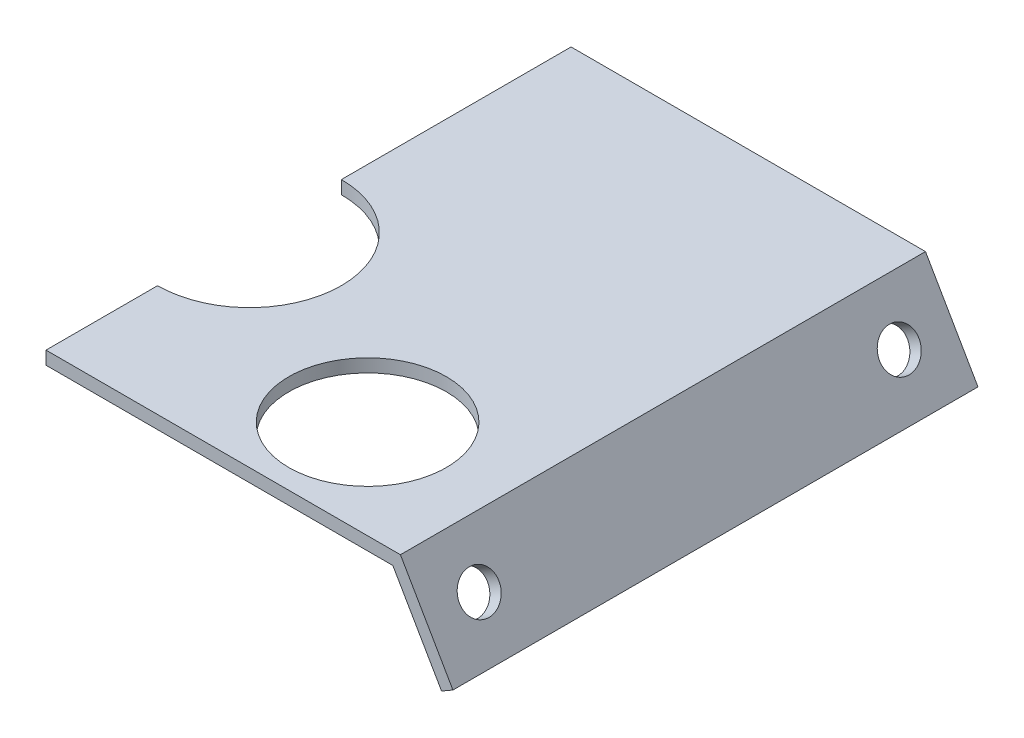
ISO-10303-21;
HEADER;
FILE_DESCRIPTION(('STEP AP214'),'2;1');
FILE_NAME('part.step','',(''),(''),'','','');
FILE_SCHEMA(('AUTOMOTIVE_DESIGN { 1 0 10303 214 1 1 1 1 }'));
ENDSEC;
DATA;
#1=APPLICATION_CONTEXT('core data for automotive mechanical design processes');
#2=APPLICATION_PROTOCOL_DEFINITION('international standard','automotive_design',2000,#1);
#3=PRODUCT_CONTEXT('',#1,'mechanical');
#4=PRODUCT('Part','Part','',(#3));
#5=PRODUCT_RELATED_PRODUCT_CATEGORY('part','',(#4));
#6=PRODUCT_DEFINITION_FORMATION('','',#4);
#7=PRODUCT_DEFINITION_CONTEXT('part definition',#1,'design');
#8=PRODUCT_DEFINITION('design','',#6,#7);
#9=PRODUCT_DEFINITION_SHAPE('','',#8);
#10=(LENGTH_UNIT() NAMED_UNIT(*) SI_UNIT(.MILLI.,.METRE.));
#11=(NAMED_UNIT(*) PLANE_ANGLE_UNIT() SI_UNIT($,.RADIAN.));
#12=(NAMED_UNIT(*) SI_UNIT($,.STERADIAN.) SOLID_ANGLE_UNIT());
#13=UNCERTAINTY_MEASURE_WITH_UNIT(LENGTH_MEASURE(1.E-05),#10,'distance_accuracy_value','');
#14=(GEOMETRIC_REPRESENTATION_CONTEXT(3) GLOBAL_UNCERTAINTY_ASSIGNED_CONTEXT((#13)) GLOBAL_UNIT_ASSIGNED_CONTEXT((#10,
#11,#12)) REPRESENTATION_CONTEXT('',''));
#15=CARTESIAN_POINT('',(0.,0.,0.));
#16=DIRECTION('',(0.,0.,1.));
#17=DIRECTION('',(1.,0.,0.));
#18=AXIS2_PLACEMENT_3D('',#15,#16,#17);
#19=CARTESIAN_POINT('',(0.,0.,40.));
#20=DIRECTION('',(1.,0.,0.));
#21=DIRECTION('',(0.,0.,-1.));
#22=AXIS2_PLACEMENT_3D('',#19,#20,#21);
#23=PLANE('',#22);
#24=DIRECTION('',(0.,0.,-1.));
#25=VECTOR('',#24,1.);
#26=CARTESIAN_POINT('',(0.,-1.,40.));
#27=LINE('',#26,#25);
#28=CARTESIAN_POINT('',(0.,-1.,17.5));
#29=VERTEX_POINT('',#28);
#30=CARTESIAN_POINT('',(0.,-1.,0.));
#31=VERTEX_POINT('',#30);
#32=EDGE_CURVE('E39',#29,#31,#27,.T.);
#33=ORIENTED_EDGE('',*,*,#32,.F.);
#34=DIRECTION('',(0.,1.,0.));
#35=VECTOR('',#34,1.);
#36=CARTESIAN_POINT('',(0.,-40.,17.5));
#37=LINE('',#36,#35);
#38=CARTESIAN_POINT('',(0.,0.,17.5));
#39=VERTEX_POINT('',#38);
#40=EDGE_CURVE('E185',#29,#39,#37,.T.);
#41=ORIENTED_EDGE('',*,*,#40,.T.);
#42=DIRECTION('',(0.,0.,-1.));
#43=VECTOR('',#42,1.);
#44=CARTESIAN_POINT('',(0.,0.,40.));
#45=LINE('',#44,#43);
#46=CARTESIAN_POINT('',(0.,0.,0.));
#47=VERTEX_POINT('',#46);
#48=EDGE_CURVE('E83',#39,#47,#45,.T.);
#49=ORIENTED_EDGE('',*,*,#48,.T.);
#50=DIRECTION('',(0.,-1.,0.));
#51=VECTOR('',#50,1.);
#52=CARTESIAN_POINT('',(0.,0.,0.));
#53=LINE('',#52,#51);
#54=EDGE_CURVE('E128',#47,#31,#53,.T.);
#55=ORIENTED_EDGE('',*,*,#54,.T.);
#56=EDGE_LOOP('',(#33,#41,#49,#55));
#57=FACE_BOUND('',#56,.T.);
#58=ADVANCED_FACE('F31',(#57),#23,.F.);
#59=CARTESIAN_POINT('',(0.,0.,40.));
#60=VERTEX_POINT('',#59);
#61=CARTESIAN_POINT('',(0.,0.,31.5));
#62=VERTEX_POINT('',#61);
#63=EDGE_CURVE('E141',#60,#62,#45,.T.);
#64=ORIENTED_EDGE('',*,*,#63,.T.);
#65=DIRECTION('',(0.,1.,0.));
#66=VECTOR('',#65,1.);
#67=CARTESIAN_POINT('',(0.,-40.,31.5));
#68=LINE('',#67,#66);
#69=CARTESIAN_POINT('',(0.,-1.,31.5));
#70=VERTEX_POINT('',#69);
#71=EDGE_CURVE('E46',#62,#70,#68,.F.);
#72=ORIENTED_EDGE('',*,*,#71,.T.);
#73=CARTESIAN_POINT('',(0.,-1.,40.));
#74=VERTEX_POINT('',#73);
#75=EDGE_CURVE('E11',#74,#70,#27,.T.);
#76=ORIENTED_EDGE('',*,*,#75,.F.);
#77=DIRECTION('',(0.,-1.,0.));
#78=VECTOR('',#77,1.);
#79=CARTESIAN_POINT('',(0.,0.,40.));
#80=LINE('',#79,#78);
#81=EDGE_CURVE('E140',#60,#74,#80,.T.);
#82=ORIENTED_EDGE('',*,*,#81,.F.);
#83=EDGE_LOOP('',(#64,#72,#76,#82));
#84=FACE_BOUND('',#83,.T.);
#85=ADVANCED_FACE('F33',(#84),#23,.F.);
#86=CARTESIAN_POINT('',(0.,-1.,40.));
#87=DIRECTION('',(0.,1.,0.));
#88=DIRECTION('',(0.,0.,1.));
#89=AXIS2_PLACEMENT_3D('',#86,#87,#88);
#90=PLANE('',#89);
#91=CARTESIAN_POINT('',(17.,-1.,32.5));
#92=DIRECTION('',(0.,1.,0.));
#93=DIRECTION('',(0.,0.,1.));
#94=AXIS2_PLACEMENT_3D('',#91,#92,#93);
#95=CIRCLE('',#94,6.);
#96=CARTESIAN_POINT('',(17.,-1.,38.5));
#97=VERTEX_POINT('',#96);
#98=EDGE_CURVE('E176',#97,#97,#95,.T.);
#99=ORIENTED_EDGE('',*,*,#98,.T.);
#100=EDGE_LOOP('',(#99));
#101=FACE_BOUND('',#100,.T.);
#102=ORIENTED_EDGE('',*,*,#75,.T.);
#103=CARTESIAN_POINT('',(0.,-1.,24.5));
#104=DIRECTION('',(0.,1.,0.));
#105=DIRECTION('',(0.,0.,1.));
#106=AXIS2_PLACEMENT_3D('',#103,#104,#105);
#107=CIRCLE('',#106,7.);
#108=EDGE_CURVE('E153',#70,#29,#107,.T.);
#109=ORIENTED_EDGE('',*,*,#108,.T.);
#110=ORIENTED_EDGE('',*,*,#32,.T.);
#111=DIRECTION('',(1.,0.,0.));
#112=VECTOR('',#111,1.);
#113=CARTESIAN_POINT('',(0.,-1.,0.));
#114=LINE('',#113,#112);
#115=CARTESIAN_POINT('',(26.4226497308104,-1.,0.));
#116=VERTEX_POINT('',#115);
#117=EDGE_CURVE('E130',#31,#116,#114,.T.);
#118=ORIENTED_EDGE('',*,*,#117,.T.);
#119=DIRECTION('',(0.,0.,-1.));
#120=VECTOR('',#119,1.);
#121=CARTESIAN_POINT('',(26.4226497308104,-1.,40.));
#122=LINE('',#121,#120);
#123=CARTESIAN_POINT('',(26.4226497308104,-1.,40.));
#124=VERTEX_POINT('',#123);
#125=EDGE_CURVE('E145',#124,#116,#122,.T.);
#126=ORIENTED_EDGE('',*,*,#125,.F.);
#127=DIRECTION('',(1.,0.,0.));
#128=VECTOR('',#127,1.);
#129=CARTESIAN_POINT('',(0.,-1.,40.));
#130=LINE('',#129,#128);
#131=EDGE_CURVE('E91',#74,#124,#130,.T.);
#132=ORIENTED_EDGE('',*,*,#131,.F.);
#133=EDGE_LOOP('',(#102,#109,#110,#118,#126,#132));
#134=FACE_BOUND('',#133,.T.);
#135=ADVANCED_FACE('F152',(#101,#134),#90,.F.);
#136=CARTESIAN_POINT('',(26.4226497308104,-1.,40.));
#137=DIRECTION('',(0.866025403784439,0.5,0.));
#138=DIRECTION('',(-0.5,0.866025403784439,0.));
#139=AXIS2_PLACEMENT_3D('',#136,#137,#138);
#140=PLANE('',#139);
#141=CARTESIAN_POINT('',(28.1339745962156,-3.96410161513775,4.));
#142=DIRECTION('',(0.866025403784439,0.5,0.));
#143=DIRECTION('',(-0.5,0.866025403784439,0.));
#144=AXIS2_PLACEMENT_3D('',#141,#142,#143);
#145=CIRCLE('',#144,1.5);
#146=CARTESIAN_POINT('',(27.3839745962156,-2.6650635094611,4.));
#147=VERTEX_POINT('',#146);
#148=EDGE_CURVE('E190',#147,#147,#145,.T.);
#149=ORIENTED_EDGE('',*,*,#148,.T.);
#150=EDGE_LOOP('',(#149));
#151=FACE_BOUND('',#150,.T.);
#152=CARTESIAN_POINT('',(28.1339745962156,-3.96410161513775,36.));
#153=DIRECTION('',(0.866025403784439,0.5,0.));
#154=DIRECTION('',(-0.5,0.866025403784439,0.));
#155=AXIS2_PLACEMENT_3D('',#152,#153,#154);
#156=CIRCLE('',#155,1.5);
#157=CARTESIAN_POINT('',(27.3839745962156,-2.66506350946109,36.));
#158=VERTEX_POINT('',#157);
#159=EDGE_CURVE('E131',#158,#158,#156,.T.);
#160=ORIENTED_EDGE('',*,*,#159,.T.);
#161=EDGE_LOOP('',(#160));
#162=FACE_BOUND('',#161,.T.);
#163=DIRECTION('',(0.5,-0.866025403784439,0.));
#164=VECTOR('',#163,1.);
#165=CARTESIAN_POINT('',(26.4226497308104,-1.,0.));
#166=LINE('',#165,#164);
#167=CARTESIAN_POINT('',(30.1339745962156,-7.42820323027551,0.));
#168=VERTEX_POINT('',#167);
#169=EDGE_CURVE('E133',#116,#168,#166,.T.);
#170=ORIENTED_EDGE('',*,*,#169,.T.);
#171=DIRECTION('',(0.,0.,-1.));
#172=VECTOR('',#171,1.);
#173=CARTESIAN_POINT('',(30.1339745962156,-7.42820323027551,40.));
#174=LINE('',#173,#172);
#175=CARTESIAN_POINT('',(30.1339745962156,-7.42820323027551,40.));
#176=VERTEX_POINT('',#175);
#177=EDGE_CURVE('E119',#176,#168,#174,.T.);
#178=ORIENTED_EDGE('',*,*,#177,.F.);
#179=DIRECTION('',(0.5,-0.866025403784439,0.));
#180=VECTOR('',#179,1.);
#181=CARTESIAN_POINT('',(26.4226497308104,-1.,40.));
#182=LINE('',#181,#180);
#183=EDGE_CURVE('E107',#124,#176,#182,.T.);
#184=ORIENTED_EDGE('',*,*,#183,.F.);
#185=ORIENTED_EDGE('',*,*,#125,.T.);
#186=EDGE_LOOP('',(#170,#178,#184,#185));
#187=FACE_BOUND('',#186,.T.);
#188=ADVANCED_FACE('F166',(#151,#162,#187),#140,.F.);
#189=CARTESIAN_POINT('',(31.,-6.92820323027552,40.));
#190=DIRECTION('',(-0.5,0.866025403784438,0.));
#191=DIRECTION('',(-0.866025403784438,-0.5,0.));
#192=AXIS2_PLACEMENT_3D('',#189,#190,#191);
#193=PLANE('',#192);
#194=DIRECTION('',(0.866025403784438,0.5,0.));
#195=VECTOR('',#194,1.);
#196=CARTESIAN_POINT('',(31.,-6.92820323027552,0.));
#197=LINE('',#196,#195);
#198=CARTESIAN_POINT('',(31.,-6.92820323027552,0.));
#199=VERTEX_POINT('',#198);
#200=EDGE_CURVE('E116',#168,#199,#197,.T.);
#201=ORIENTED_EDGE('',*,*,#200,.T.);
#202=DIRECTION('',(0.,0.,-1.));
#203=VECTOR('',#202,1.);
#204=CARTESIAN_POINT('',(31.,-6.92820323027552,40.));
#205=LINE('',#204,#203);
#206=CARTESIAN_POINT('',(31.,-6.92820323027552,40.));
#207=VERTEX_POINT('',#206);
#208=EDGE_CURVE('E113',#207,#199,#205,.T.);
#209=ORIENTED_EDGE('',*,*,#208,.F.);
#210=DIRECTION('',(0.866025403784438,0.5,0.));
#211=VECTOR('',#210,1.);
#212=CARTESIAN_POINT('',(31.,-6.92820323027552,40.));
#213=LINE('',#212,#211);
#214=EDGE_CURVE('E100',#176,#207,#213,.T.);
#215=ORIENTED_EDGE('',*,*,#214,.F.);
#216=ORIENTED_EDGE('',*,*,#177,.T.);
#217=EDGE_LOOP('',(#201,#209,#215,#216));
#218=FACE_BOUND('',#217,.T.);
#219=ADVANCED_FACE('F114',(#218),#193,.F.);
#220=CARTESIAN_POINT('',(27.,0.,40.));
#221=DIRECTION('',(-0.86602540378444,-0.499999999999998,0.));
#222=DIRECTION('',(0.499999999999998,-0.86602540378444,0.));
#223=AXIS2_PLACEMENT_3D('',#220,#221,#222);
#224=PLANE('',#223);
#225=CARTESIAN_POINT('',(29.,-3.46410161513776,4.));
#226=DIRECTION('',(0.86602540378444,0.499999999999998,0.));
#227=DIRECTION('',(-0.499999999999998,0.86602540378444,0.));
#228=AXIS2_PLACEMENT_3D('',#225,#226,#227);
#229=CIRCLE('',#228,1.5);
#230=CARTESIAN_POINT('',(28.25,-2.1650635094611,4.));
#231=VERTEX_POINT('',#230);
#232=EDGE_CURVE('E187',#231,#231,#229,.T.);
#233=ORIENTED_EDGE('',*,*,#232,.F.);
#234=EDGE_LOOP('',(#233));
#235=FACE_BOUND('',#234,.T.);
#236=CARTESIAN_POINT('',(29.,-3.46410161513776,36.));
#237=DIRECTION('',(0.86602540378444,0.499999999999998,0.));
#238=DIRECTION('',(-0.499999999999998,0.86602540378444,0.));
#239=AXIS2_PLACEMENT_3D('',#236,#237,#238);
#240=CIRCLE('',#239,1.5);
#241=CARTESIAN_POINT('',(28.25,-2.1650635094611,36.));
#242=VERTEX_POINT('',#241);
#243=EDGE_CURVE('E193',#242,#242,#240,.T.);
#244=ORIENTED_EDGE('',*,*,#243,.F.);
#245=EDGE_LOOP('',(#244));
#246=FACE_BOUND('',#245,.T.);
#247=DIRECTION('',(-0.499999999999998,0.86602540378444,0.));
#248=VECTOR('',#247,1.);
#249=CARTESIAN_POINT('',(27.,0.,0.));
#250=LINE('',#249,#248);
#251=CARTESIAN_POINT('',(27.,0.,0.));
#252=VERTEX_POINT('',#251);
#253=EDGE_CURVE('E136',#199,#252,#250,.T.);
#254=ORIENTED_EDGE('',*,*,#253,.T.);
#255=DIRECTION('',(0.,0.,-1.));
#256=VECTOR('',#255,1.);
#257=CARTESIAN_POINT('',(27.,0.,40.));
#258=LINE('',#257,#256);
#259=CARTESIAN_POINT('',(27.,0.,40.));
#260=VERTEX_POINT('',#259);
#261=EDGE_CURVE('E120',#260,#252,#258,.T.);
#262=ORIENTED_EDGE('',*,*,#261,.F.);
#263=DIRECTION('',(-0.499999999999998,0.86602540378444,0.));
#264=VECTOR('',#263,1.);
#265=CARTESIAN_POINT('',(27.,0.,40.));
#266=LINE('',#265,#264);
#267=EDGE_CURVE('E104',#207,#260,#266,.T.);
#268=ORIENTED_EDGE('',*,*,#267,.F.);
#269=ORIENTED_EDGE('',*,*,#208,.T.);
#270=EDGE_LOOP('',(#254,#262,#268,#269));
#271=FACE_BOUND('',#270,.T.);
#272=ADVANCED_FACE('F122',(#235,#246,#271),#224,.F.);
#273=CARTESIAN_POINT('',(0.,0.,40.));
#274=DIRECTION('',(0.,-1.,0.));
#275=DIRECTION('',(0.,0.,-1.));
#276=AXIS2_PLACEMENT_3D('',#273,#274,#275);
#277=PLANE('',#276);
#278=CARTESIAN_POINT('',(17.,0.,32.5));
#279=DIRECTION('',(0.,1.,0.));
#280=DIRECTION('',(0.,0.,1.));
#281=AXIS2_PLACEMENT_3D('',#278,#279,#280);
#282=CIRCLE('',#281,6.);
#283=CARTESIAN_POINT('',(17.,0.,38.5));
#284=VERTEX_POINT('',#283);
#285=EDGE_CURVE('E180',#284,#284,#282,.T.);
#286=ORIENTED_EDGE('',*,*,#285,.F.);
#287=EDGE_LOOP('',(#286));
#288=FACE_BOUND('',#287,.T.);
#289=ORIENTED_EDGE('',*,*,#48,.F.);
#290=CARTESIAN_POINT('',(0.,0.,24.5));
#291=DIRECTION('',(0.,1.,0.));
#292=DIRECTION('',(0.,0.,1.));
#293=AXIS2_PLACEMENT_3D('',#290,#291,#292);
#294=CIRCLE('',#293,7.);
#295=EDGE_CURVE('E173',#62,#39,#294,.T.);
#296=ORIENTED_EDGE('',*,*,#295,.F.);
#297=ORIENTED_EDGE('',*,*,#63,.F.);
#298=DIRECTION('',(-1.,0.,0.));
#299=VECTOR('',#298,1.);
#300=CARTESIAN_POINT('',(0.,0.,40.));
#301=LINE('',#300,#299);
#302=EDGE_CURVE('E55',#260,#60,#301,.T.);
#303=ORIENTED_EDGE('',*,*,#302,.F.);
#304=ORIENTED_EDGE('',*,*,#261,.T.);
#305=DIRECTION('',(-1.,0.,0.));
#306=VECTOR('',#305,1.);
#307=CARTESIAN_POINT('',(0.,0.,0.));
#308=LINE('',#307,#306);
#309=EDGE_CURVE('E138',#252,#47,#308,.T.);
#310=ORIENTED_EDGE('',*,*,#309,.T.);
#311=EDGE_LOOP('',(#289,#296,#297,#303,#304,#310));
#312=FACE_BOUND('',#311,.T.);
#313=ADVANCED_FACE('F172',(#288,#312),#277,.F.);
#314=CARTESIAN_POINT('',(0.,-1.,40.));
#315=DIRECTION('',(0.,0.,1.));
#316=DIRECTION('',(1.,0.,0.));
#317=AXIS2_PLACEMENT_3D('',#314,#315,#316);
#318=PLANE('',#317);
#319=ORIENTED_EDGE('',*,*,#81,.T.);
#320=ORIENTED_EDGE('',*,*,#131,.T.);
#321=ORIENTED_EDGE('',*,*,#183,.T.);
#322=ORIENTED_EDGE('',*,*,#214,.T.);
#323=ORIENTED_EDGE('',*,*,#267,.T.);
#324=ORIENTED_EDGE('',*,*,#302,.T.);
#325=EDGE_LOOP('',(#319,#320,#321,#322,#323,#324));
#326=FACE_BOUND('',#325,.T.);
#327=ADVANCED_FACE('F102',(#326),#318,.T.);
#328=CARTESIAN_POINT('',(0.,-1.,0.));
#329=DIRECTION('',(0.,0.,1.));
#330=DIRECTION('',(1.,0.,0.));
#331=AXIS2_PLACEMENT_3D('',#328,#329,#330);
#332=PLANE('',#331);
#333=ORIENTED_EDGE('',*,*,#54,.F.);
#334=ORIENTED_EDGE('',*,*,#309,.F.);
#335=ORIENTED_EDGE('',*,*,#253,.F.);
#336=ORIENTED_EDGE('',*,*,#200,.F.);
#337=ORIENTED_EDGE('',*,*,#169,.F.);
#338=ORIENTED_EDGE('',*,*,#117,.F.);
#339=EDGE_LOOP('',(#333,#334,#335,#336,#337,#338));
#340=FACE_BOUND('',#339,.T.);
#341=ADVANCED_FACE('F156',(#340),#332,.F.);
#342=CARTESIAN_POINT('',(-5.6410161513776,-23.4641016151377,36.));
#343=DIRECTION('',(0.86602540378444,0.499999999999998,0.));
#344=DIRECTION('',(-0.499999999999998,0.86602540378444,0.));
#345=AXIS2_PLACEMENT_3D('',#342,#343,#344);
#346=CYLINDRICAL_SURFACE('',#345,1.5);
#347=ORIENTED_EDGE('',*,*,#243,.T.);
#348=EDGE_LOOP('',(#347));
#349=FACE_BOUND('',#348,.T.);
#350=ORIENTED_EDGE('',*,*,#159,.F.);
#351=EDGE_LOOP('',(#350));
#352=FACE_BOUND('',#351,.T.);
#353=ADVANCED_FACE('F216',(#349,#352),#346,.F.);
#354=CARTESIAN_POINT('',(-5.6410161513776,-23.4641016151377,4.));
#355=DIRECTION('',(0.86602540378444,0.499999999999998,0.));
#356=DIRECTION('',(-0.499999999999998,0.86602540378444,0.));
#357=AXIS2_PLACEMENT_3D('',#354,#355,#356);
#358=CYLINDRICAL_SURFACE('',#357,1.5);
#359=ORIENTED_EDGE('',*,*,#232,.T.);
#360=EDGE_LOOP('',(#359));
#361=FACE_BOUND('',#360,.T.);
#362=ORIENTED_EDGE('',*,*,#148,.F.);
#363=EDGE_LOOP('',(#362));
#364=FACE_BOUND('',#363,.T.);
#365=ADVANCED_FACE('F221',(#361,#364),#358,.F.);
#366=CARTESIAN_POINT('',(0.,-40.,24.5));
#367=DIRECTION('',(0.,1.,0.));
#368=DIRECTION('',(0.,0.,1.));
#369=AXIS2_PLACEMENT_3D('',#366,#367,#368);
#370=CYLINDRICAL_SURFACE('',#369,7.);
#371=ORIENTED_EDGE('',*,*,#108,.F.);
#372=ORIENTED_EDGE('',*,*,#71,.F.);
#373=ORIENTED_EDGE('',*,*,#295,.T.);
#374=ORIENTED_EDGE('',*,*,#40,.F.);
#375=EDGE_LOOP('',(#371,#372,#373,#374));
#376=FACE_BOUND('',#375,.T.);
#377=ADVANCED_FACE('F225',(#376),#370,.F.);
#378=CARTESIAN_POINT('',(17.,-40.,32.5));
#379=DIRECTION('',(0.,1.,0.));
#380=DIRECTION('',(0.,0.,1.));
#381=AXIS2_PLACEMENT_3D('',#378,#379,#380);
#382=CYLINDRICAL_SURFACE('',#381,6.);
#383=ORIENTED_EDGE('',*,*,#285,.T.);
#384=EDGE_LOOP('',(#383));
#385=FACE_BOUND('',#384,.T.);
#386=ORIENTED_EDGE('',*,*,#98,.F.);
#387=EDGE_LOOP('',(#386));
#388=FACE_BOUND('',#387,.T.);
#389=ADVANCED_FACE('F229',(#385,#388),#382,.F.);
#390=CLOSED_SHELL('',(#58,#85,#135,#188,#219,#272,#313,#327,#341,#353,#365,#377,#389));
#391=MANIFOLD_SOLID_BREP('B2',#390);
#392=ADVANCED_BREP_SHAPE_REPRESENTATION('',(#18,#391),#14);
#393=SHAPE_DEFINITION_REPRESENTATION(#9,#392);
ENDSEC;
END-ISO-10303-21;
